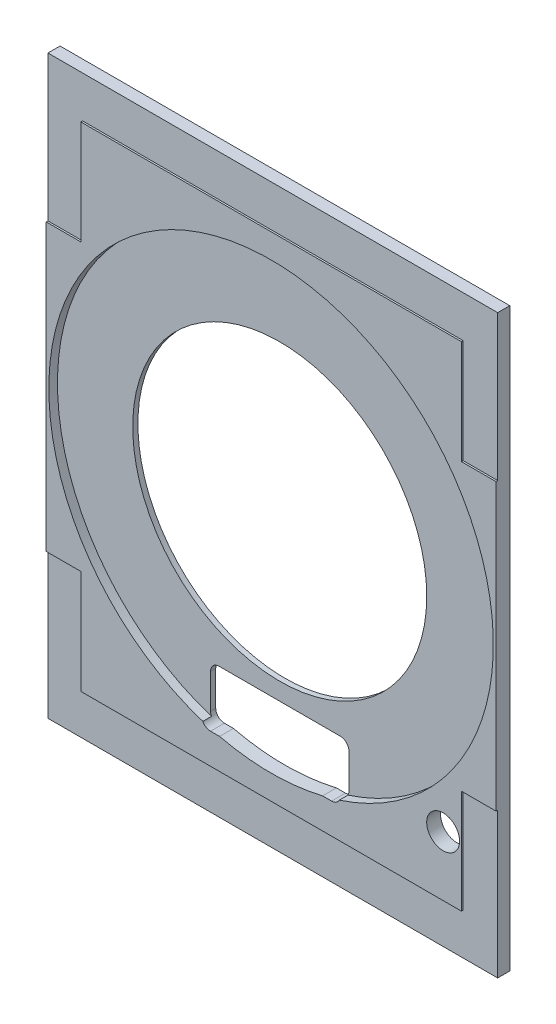
ISO-10303-21;
HEADER;
FILE_DESCRIPTION(('STEP AP214'),'2;1');
FILE_NAME('part.step','',(''),(''),'','','');
FILE_SCHEMA(('AUTOMOTIVE_DESIGN { 1 0 10303 214 1 1 1 1 }'));
ENDSEC;
DATA;
#1=APPLICATION_CONTEXT('core data for automotive mechanical design processes');
#2=APPLICATION_PROTOCOL_DEFINITION('international standard','automotive_design',2000,#1);
#3=PRODUCT_CONTEXT('',#1,'mechanical');
#4=PRODUCT('Part','Part','',(#3));
#5=PRODUCT_RELATED_PRODUCT_CATEGORY('part','',(#4));
#6=PRODUCT_DEFINITION_FORMATION('','',#4);
#7=PRODUCT_DEFINITION_CONTEXT('part definition',#1,'design');
#8=PRODUCT_DEFINITION('design','',#6,#7);
#9=PRODUCT_DEFINITION_SHAPE('','',#8);
#10=(LENGTH_UNIT() NAMED_UNIT(*) SI_UNIT(.MILLI.,.METRE.));
#11=(NAMED_UNIT(*) PLANE_ANGLE_UNIT() SI_UNIT($,.RADIAN.));
#12=(NAMED_UNIT(*) SI_UNIT($,.STERADIAN.) SOLID_ANGLE_UNIT());
#13=UNCERTAINTY_MEASURE_WITH_UNIT(LENGTH_MEASURE(1.E-05),#10,'distance_accuracy_value','');
#14=(GEOMETRIC_REPRESENTATION_CONTEXT(3) GLOBAL_UNCERTAINTY_ASSIGNED_CONTEXT((#13)) GLOBAL_UNIT_ASSIGNED_CONTEXT((#10,
#11,#12)) REPRESENTATION_CONTEXT('',''));
#15=CARTESIAN_POINT('',(0.,0.,0.));
#16=DIRECTION('',(0.,0.,1.));
#17=DIRECTION('',(1.,0.,0.));
#18=AXIS2_PLACEMENT_3D('',#15,#16,#17);
#19=CARTESIAN_POINT('',(-86.6793476114973,-420.602297752564,-868.98578652296));
#20=DIRECTION('',(1.,0.,0.));
#21=DIRECTION('',(0.,1.,0.));
#22=AXIS2_PLACEMENT_3D('',#19,#20,#21);
#23=PLANE('',#22);
#24=DIRECTION('',(0.,1.,0.));
#25=VECTOR('',#24,1.);
#26=CARTESIAN_POINT('',(-86.6793476114973,-420.602297752566,-899.48578652296));
#27=LINE('',#26,#25);
#28=CARTESIAN_POINT('',(-86.6793451287472,-503.102316223515,-899.48578652296));
#29=VERTEX_POINT('',#28);
#30=CARTESIAN_POINT('',(-86.6793476114973,-563.179524908949,-899.48578652296));
#31=VERTEX_POINT('',#30);
#32=EDGE_CURVE('E220',#29,#31,#27,.F.);
#33=ORIENTED_EDGE('',*,*,#32,.F.);
#34=DIRECTION('',(0.,0.,1.));
#35=VECTOR('',#34,1.);
#36=CARTESIAN_POINT('',(-86.6793426459971,-503.102316223515,-881.985844802857));
#37=LINE('',#36,#35);
#38=CARTESIAN_POINT('',(-86.6793451287472,-503.102316223515,-898.485786522958));
#39=VERTEX_POINT('',#38);
#40=EDGE_CURVE('E243',#39,#29,#37,.F.);
#41=ORIENTED_EDGE('',*,*,#40,.F.);
#42=DIRECTION('',(0.,1.,0.));
#43=VECTOR('',#42,1.);
#44=CARTESIAN_POINT('',(-86.6793426459971,-420.602282333374,-898.485786522958));
#45=LINE('',#44,#43);
#46=CARTESIAN_POINT('',(-86.6793463701223,-563.179524908949,-898.485786522958));
#47=VERTEX_POINT('',#46);
#48=EDGE_CURVE('E125',#39,#47,#45,.F.);
#49=ORIENTED_EDGE('',*,*,#48,.T.);
#50=DIRECTION('',(0.,0.,-1.));
#51=VECTOR('',#50,1.);
#52=CARTESIAN_POINT('',(-86.6793476114973,-563.179524908949,-866.48578652296));
#53=LINE('',#52,#51);
#54=EDGE_CURVE('E272',#31,#47,#53,.F.);
#55=ORIENTED_EDGE('',*,*,#54,.F.);
#56=EDGE_LOOP('',(#33,#41,#49,#55));
#57=FACE_BOUND('',#56,.T.);
#58=ADVANCED_FACE('F17',(#57),#23,.T.);
#59=CARTESIAN_POINT('',(-196.679347611489,-563.179524908949,-866.48578652296));
#60=DIRECTION('',(0.,-1.,0.));
#61=DIRECTION('',(0.,0.,-1.));
#62=AXIS2_PLACEMENT_3D('',#59,#60,#61);
#63=PLANE('',#62);
#64=DIRECTION('',(0.,0.,1.));
#65=VECTOR('',#64,1.);
#66=CARTESIAN_POINT('',(-306.686091028778,-563.179524908949,-868.98578652296));
#67=LINE('',#66,#65);
#68=CARTESIAN_POINT('',(-306.686091028778,-563.179524908949,-899.48578652296));
#69=VERTEX_POINT('',#68);
#70=CARTESIAN_POINT('',(-306.686091028778,-563.179524908949,-898.485786522958));
#71=VERTEX_POINT('',#70);
#72=EDGE_CURVE('E269',#69,#71,#67,.T.);
#73=ORIENTED_EDGE('',*,*,#72,.F.);
#74=DIRECTION('',(1.,0.,0.));
#75=VECTOR('',#74,1.);
#76=CARTESIAN_POINT('',(-316.686091028776,-563.179524908949,-899.48578652296));
#77=LINE('',#76,#75);
#78=EDGE_CURVE('E217',#31,#69,#77,.F.);
#79=ORIENTED_EDGE('',*,*,#78,.F.);
#80=ORIENTED_EDGE('',*,*,#54,.T.);
#81=DIRECTION('',(-1.,0.,0.));
#82=VECTOR('',#81,1.);
#83=CARTESIAN_POINT('',(-196.682719320139,-563.179524908949,-898.485786522958));
#84=LINE('',#83,#82);
#85=EDGE_CURVE('E199',#47,#71,#84,.T.);
#86=ORIENTED_EDGE('',*,*,#85,.T.);
#87=EDGE_LOOP('',(#73,#79,#80,#86));
#88=FACE_BOUND('',#87,.T.);
#89=ADVANCED_FACE('F487',(#88),#63,.T.);
#90=CARTESIAN_POINT('',(-306.686091028778,-420.602297752566,-868.98578652296));
#91=DIRECTION('',(-1.,0.,0.));
#92=DIRECTION('',(0.,0.,1.));
#93=AXIS2_PLACEMENT_3D('',#90,#91,#92);
#94=PLANE('',#93);
#95=DIRECTION('',(0.,1.,0.));
#96=VECTOR('',#95,1.);
#97=CARTESIAN_POINT('',(-306.686091028778,-420.602297752566,-899.48578652296));
#98=LINE('',#97,#96);
#99=CARTESIAN_POINT('',(-306.686091028778,-503.102285385131,-899.48578652296));
#100=VERTEX_POINT('',#99);
#101=EDGE_CURVE('E214',#69,#100,#98,.T.);
#102=ORIENTED_EDGE('',*,*,#101,.F.);
#103=ORIENTED_EDGE('',*,*,#72,.T.);
#104=DIRECTION('',(0.,1.,0.));
#105=VECTOR('',#104,1.);
#106=CARTESIAN_POINT('',(-306.686091028778,-420.602282333374,-898.485786522958));
#107=LINE('',#106,#105);
#108=CARTESIAN_POINT('',(-306.686091028778,-503.102285385131,-898.485786522958));
#109=VERTEX_POINT('',#108);
#110=EDGE_CURVE('E196',#71,#109,#107,.T.);
#111=ORIENTED_EDGE('',*,*,#110,.T.);
#112=DIRECTION('',(0.,0.,-1.));
#113=VECTOR('',#112,1.);
#114=CARTESIAN_POINT('',(-306.686091028778,-503.102285385131,-881.985844802857));
#115=LINE('',#114,#113);
#116=EDGE_CURVE('E263',#100,#109,#115,.F.);
#117=ORIENTED_EDGE('',*,*,#116,.F.);
#118=EDGE_LOOP('',(#102,#103,#111,#117));
#119=FACE_BOUND('',#118,.T.);
#120=ADVANCED_FACE('F484',(#119),#94,.T.);
#121=CARTESIAN_POINT('',(-306.686100959777,-503.102285385131,-881.985844802857));
#122=DIRECTION('',(0.,-1.,0.));
#123=DIRECTION('',(0.,0.,-1.));
#124=AXIS2_PLACEMENT_3D('',#121,#122,#123);
#125=PLANE('',#124);
#126=DIRECTION('',(1.,0.,0.));
#127=VECTOR('',#126,1.);
#128=CARTESIAN_POINT('',(-316.686091028776,-503.102285385131,-899.48578652296));
#129=LINE('',#128,#127);
#130=CARTESIAN_POINT('',(-326.686091028777,-503.102285385131,-899.48578652296));
#131=VERTEX_POINT('',#130);
#132=EDGE_CURVE('E126',#100,#131,#129,.F.);
#133=ORIENTED_EDGE('',*,*,#132,.F.);
#134=ORIENTED_EDGE('',*,*,#116,.T.);
#135=DIRECTION('',(-1.,0.,0.));
#136=VECTOR('',#135,1.);
#137=CARTESIAN_POINT('',(-196.682719320139,-503.102285385131,-898.485786522958));
#138=LINE('',#137,#136);
#139=CARTESIAN_POINT('',(-326.686091028777,-503.102285385131,-898.485786522958));
#140=VERTEX_POINT('',#139);
#141=EDGE_CURVE('E193',#109,#140,#138,.T.);
#142=ORIENTED_EDGE('',*,*,#141,.T.);
#143=DIRECTION('',(0.,0.,-1.));
#144=VECTOR('',#143,1.);
#145=CARTESIAN_POINT('',(-326.686091028777,-503.102285385131,-881.985844802857));
#146=LINE('',#145,#144);
#147=EDGE_CURVE('E266',#140,#131,#146,.T.);
#148=ORIENTED_EDGE('',*,*,#147,.T.);
#149=EDGE_LOOP('',(#133,#134,#142,#148));
#150=FACE_BOUND('',#149,.T.);
#151=ADVANCED_FACE('F481',(#150),#125,.T.);
#152=CARTESIAN_POINT('',(-306.686100959777,-338.102279281615,-881.985844802857));
#153=DIRECTION('',(0.,1.,0.));
#154=DIRECTION('',(0.,0.,1.));
#155=AXIS2_PLACEMENT_3D('',#152,#153,#154);
#156=PLANE('',#155);
#157=DIRECTION('',(1.,0.,0.));
#158=VECTOR('',#157,1.);
#159=CARTESIAN_POINT('',(-316.686091028779,-338.102279281615,-899.48578652296));
#160=LINE('',#159,#158);
#161=CARTESIAN_POINT('',(-326.686091028777,-338.102279281615,-899.48578652296));
#162=VERTEX_POINT('',#161);
#163=CARTESIAN_POINT('',(-306.686091028778,-338.102279281615,-899.48578652296));
#164=VERTEX_POINT('',#163);
#165=EDGE_CURVE('E226',#162,#164,#160,.T.);
#166=ORIENTED_EDGE('',*,*,#165,.F.);
#167=DIRECTION('',(0.,0.,1.));
#168=VECTOR('',#167,1.);
#169=CARTESIAN_POINT('',(-326.686091028777,-338.102279281615,-881.985844802857));
#170=LINE('',#169,#168);
#171=CARTESIAN_POINT('',(-326.686091028777,-338.102279281615,-898.485786522958));
#172=VERTEX_POINT('',#171);
#173=EDGE_CURVE('E260',#162,#172,#170,.T.);
#174=ORIENTED_EDGE('',*,*,#173,.T.);
#175=DIRECTION('',(-1.,0.,0.));
#176=VECTOR('',#175,1.);
#177=CARTESIAN_POINT('',(-196.682719320139,-338.102279281615,-898.485786522958));
#178=LINE('',#177,#176);
#179=CARTESIAN_POINT('',(-306.686091028778,-338.102279281615,-898.485786522958));
#180=VERTEX_POINT('',#179);
#181=EDGE_CURVE('E190',#172,#180,#178,.F.);
#182=ORIENTED_EDGE('',*,*,#181,.T.);
#183=DIRECTION('',(0.,0.,1.));
#184=VECTOR('',#183,1.);
#185=CARTESIAN_POINT('',(-306.686091028778,-338.102279281615,-868.98578652296));
#186=LINE('',#185,#184);
#187=EDGE_CURVE('E257',#164,#180,#186,.T.);
#188=ORIENTED_EDGE('',*,*,#187,.F.);
#189=EDGE_LOOP('',(#166,#174,#182,#188));
#190=FACE_BOUND('',#189,.T.);
#191=ADVANCED_FACE('F459',(#190),#156,.T.);
#192=CARTESIAN_POINT('',(-306.686091028778,-420.602297752566,-868.98578652296));
#193=DIRECTION('',(-1.,0.,0.));
#194=DIRECTION('',(0.,0.,1.));
#195=AXIS2_PLACEMENT_3D('',#192,#193,#194);
#196=PLANE('',#195);
#197=DIRECTION('',(0.,1.,0.));
#198=VECTOR('',#197,1.);
#199=CARTESIAN_POINT('',(-306.686091028778,-420.602297752566,-899.48578652296));
#200=LINE('',#199,#198);
#201=CARTESIAN_POINT('',(-306.686091028778,-278.025070596186,-899.48578652296));
#202=VERTEX_POINT('',#201);
#203=EDGE_CURVE('E238',#164,#202,#200,.T.);
#204=ORIENTED_EDGE('',*,*,#203,.F.);
#205=ORIENTED_EDGE('',*,*,#187,.T.);
#206=DIRECTION('',(0.,1.,0.));
#207=VECTOR('',#206,1.);
#208=CARTESIAN_POINT('',(-306.686091028778,-420.602282333374,-898.485786522958));
#209=LINE('',#208,#207);
#210=CARTESIAN_POINT('',(-306.686091028778,-278.025070596186,-898.485786522958));
#211=VERTEX_POINT('',#210);
#212=EDGE_CURVE('E187',#180,#211,#209,.T.);
#213=ORIENTED_EDGE('',*,*,#212,.T.);
#214=DIRECTION('',(0.,0.,1.));
#215=VECTOR('',#214,1.);
#216=CARTESIAN_POINT('',(-306.686091028778,-278.025070596186,-866.48578652296));
#217=LINE('',#216,#215);
#218=EDGE_CURVE('E254',#202,#211,#217,.T.);
#219=ORIENTED_EDGE('',*,*,#218,.F.);
#220=EDGE_LOOP('',(#204,#205,#213,#219));
#221=FACE_BOUND('',#220,.T.);
#222=ADVANCED_FACE('F449',(#221),#196,.T.);
#223=CARTESIAN_POINT('',(-196.686091028777,-278.025070596186,-866.48578652296));
#224=DIRECTION('',(0.,1.,0.));
#225=DIRECTION('',(-1.,0.,0.));
#226=AXIS2_PLACEMENT_3D('',#223,#224,#225);
#227=PLANE('',#226);
#228=ORIENTED_EDGE('',*,*,#218,.T.);
#229=DIRECTION('',(-1.,0.,0.));
#230=VECTOR('',#229,1.);
#231=CARTESIAN_POINT('',(-196.682719320139,-278.025070596186,-898.485786522958));
#232=LINE('',#231,#230);
#233=CARTESIAN_POINT('',(-86.6793476114973,-278.025070596186,-898.485786522958));
#234=VERTEX_POINT('',#233);
#235=EDGE_CURVE('E184',#211,#234,#232,.F.);
#236=ORIENTED_EDGE('',*,*,#235,.T.);
#237=DIRECTION('',(0.,0.,1.));
#238=VECTOR('',#237,1.);
#239=CARTESIAN_POINT('',(-86.6793476114973,-278.025070596186,-868.98578652296));
#240=LINE('',#239,#238);
#241=CARTESIAN_POINT('',(-86.6793476114973,-278.025070596186,-899.48578652296));
#242=VERTEX_POINT('',#241);
#243=EDGE_CURVE('E251',#242,#234,#240,.T.);
#244=ORIENTED_EDGE('',*,*,#243,.F.);
#245=DIRECTION('',(1.,0.,0.));
#246=VECTOR('',#245,1.);
#247=CARTESIAN_POINT('',(-316.686091028779,-278.025070596186,-899.48578652296));
#248=LINE('',#247,#246);
#249=EDGE_CURVE('E235',#202,#242,#248,.T.);
#250=ORIENTED_EDGE('',*,*,#249,.F.);
#251=EDGE_LOOP('',(#228,#236,#244,#250));
#252=FACE_BOUND('',#251,.T.);
#253=ADVANCED_FACE('F453',(#252),#227,.T.);
#254=CARTESIAN_POINT('',(-86.6793476114973,-420.602297752564,-868.98578652296));
#255=DIRECTION('',(1.,0.,0.));
#256=DIRECTION('',(0.,1.,0.));
#257=AXIS2_PLACEMENT_3D('',#254,#255,#256);
#258=PLANE('',#257);
#259=DIRECTION('',(0.,1.,0.));
#260=VECTOR('',#259,1.);
#261=CARTESIAN_POINT('',(-86.6793476114973,-420.602297752566,-899.48578652296));
#262=LINE('',#261,#260);
#263=CARTESIAN_POINT('',(-86.6793476114973,-338.102310119999,-899.48578652296));
#264=VERTEX_POINT('',#263);
#265=EDGE_CURVE('E232',#242,#264,#262,.F.);
#266=ORIENTED_EDGE('',*,*,#265,.F.);
#267=ORIENTED_EDGE('',*,*,#243,.T.);
#268=DIRECTION('',(0.,1.,0.));
#269=VECTOR('',#268,1.);
#270=CARTESIAN_POINT('',(-86.6793476114973,-420.602282333374,-898.485786522958));
#271=LINE('',#270,#269);
#272=CARTESIAN_POINT('',(-86.6793476114973,-338.102310119999,-898.485786522958));
#273=VERTEX_POINT('',#272);
#274=EDGE_CURVE('E177',#234,#273,#271,.F.);
#275=ORIENTED_EDGE('',*,*,#274,.T.);
#276=DIRECTION('',(0.,0.,1.));
#277=VECTOR('',#276,1.);
#278=CARTESIAN_POINT('',(-86.6793476114973,-338.102310119999,-881.985844802857));
#279=LINE('',#278,#277);
#280=EDGE_CURVE('E245',#264,#273,#279,.T.);
#281=ORIENTED_EDGE('',*,*,#280,.F.);
#282=EDGE_LOOP('',(#266,#267,#275,#281));
#283=FACE_BOUND('',#282,.T.);
#284=ADVANCED_FACE('F467',(#283),#258,.T.);
#285=CARTESIAN_POINT('',(-86.6793376804968,-338.102310119999,-881.985844802857));
#286=DIRECTION('',(0.,1.,0.));
#287=DIRECTION('',(-1.,0.,0.));
#288=AXIS2_PLACEMENT_3D('',#285,#286,#287);
#289=PLANE('',#288);
#290=DIRECTION('',(1.,0.,0.));
#291=VECTOR('',#290,1.);
#292=CARTESIAN_POINT('',(-316.686091028779,-338.102310119999,-899.48578652296));
#293=LINE('',#292,#291);
#294=CARTESIAN_POINT('',(-66.6793476115006,-338.102310119999,-899.48578652296));
#295=VERTEX_POINT('',#294);
#296=EDGE_CURVE('E229',#264,#295,#293,.T.);
#297=ORIENTED_EDGE('',*,*,#296,.F.);
#298=ORIENTED_EDGE('',*,*,#280,.T.);
#299=DIRECTION('',(-1.,0.,0.));
#300=VECTOR('',#299,1.);
#301=CARTESIAN_POINT('',(-196.682719320139,-338.102310119999,-898.485786522958));
#302=LINE('',#301,#300);
#303=CARTESIAN_POINT('',(-66.6793476115006,-338.102310119999,-898.485786522958));
#304=VERTEX_POINT('',#303);
#305=EDGE_CURVE('E168',#273,#304,#302,.F.);
#306=ORIENTED_EDGE('',*,*,#305,.T.);
#307=DIRECTION('',(0.,0.,1.));
#308=VECTOR('',#307,1.);
#309=CARTESIAN_POINT('',(-66.6793476115006,-338.102310119999,-881.985844802857));
#310=LINE('',#309,#308);
#311=EDGE_CURVE('E248',#304,#295,#310,.F.);
#312=ORIENTED_EDGE('',*,*,#311,.T.);
#313=EDGE_LOOP('',(#297,#298,#306,#312));
#314=FACE_BOUND('',#313,.T.);
#315=ADVANCED_FACE('F492',(#314),#289,.T.);
#316=CARTESIAN_POINT('',(-86.6793376804968,-503.102316223515,-881.985844802857));
#317=DIRECTION('',(0.,-1.,0.));
#318=DIRECTION('',(1.,0.,0.));
#319=AXIS2_PLACEMENT_3D('',#316,#317,#318);
#320=PLANE('',#319);
#321=DIRECTION('',(1.,0.,0.));
#322=VECTOR('',#321,1.);
#323=CARTESIAN_POINT('',(-316.686091028776,-503.102316223515,-899.48578652296));
#324=LINE('',#323,#322);
#325=CARTESIAN_POINT('',(-66.6793476115006,-503.102316223515,-899.48578652296));
#326=VERTEX_POINT('',#325);
#327=EDGE_CURVE('E223',#326,#29,#324,.F.);
#328=ORIENTED_EDGE('',*,*,#327,.F.);
#329=DIRECTION('',(0.,0.,1.));
#330=VECTOR('',#329,1.);
#331=CARTESIAN_POINT('',(-66.6793476115006,-503.102316223515,-881.985844802857));
#332=LINE('',#331,#330);
#333=CARTESIAN_POINT('',(-66.6793476115006,-503.102316223515,-898.485786522958));
#334=VERTEX_POINT('',#333);
#335=EDGE_CURVE('E241',#326,#334,#332,.T.);
#336=ORIENTED_EDGE('',*,*,#335,.T.);
#337=DIRECTION('',(-1.,0.,0.));
#338=VECTOR('',#337,1.);
#339=CARTESIAN_POINT('',(-196.682719320139,-503.102316223515,-898.485786522958));
#340=LINE('',#339,#338);
#341=EDGE_CURVE('E163',#334,#39,#340,.T.);
#342=ORIENTED_EDGE('',*,*,#341,.T.);
#343=ORIENTED_EDGE('',*,*,#40,.T.);
#344=EDGE_LOOP('',(#328,#336,#342,#343));
#345=FACE_BOUND('',#344,.T.);
#346=ADVANCED_FACE('F491',(#345),#320,.T.);
#347=CARTESIAN_POINT('',(-316.686091028779,-420.602297752566,-899.48578652296));
#348=DIRECTION('',(0.,0.,1.));
#349=DIRECTION('',(1.,0.,0.));
#350=AXIS2_PLACEMENT_3D('',#347,#348,#349);
#351=PLANE('',#350);
#352=DIRECTION('',(0.,1.,0.));
#353=VECTOR('',#352,1.);
#354=CARTESIAN_POINT('',(-326.686091028777,-420.602282333374,-899.48578652296));
#355=LINE('',#354,#353);
#356=CARTESIAN_POINT('',(-326.686091028777,-254.025070596186,-899.48578652296));
#357=VERTEX_POINT('',#356);
#358=EDGE_CURVE('E353',#357,#162,#355,.F.);
#359=ORIENTED_EDGE('',*,*,#358,.T.);
#360=ORIENTED_EDGE('',*,*,#165,.T.);
#361=ORIENTED_EDGE('',*,*,#203,.T.);
#362=ORIENTED_EDGE('',*,*,#249,.T.);
#363=ORIENTED_EDGE('',*,*,#265,.T.);
#364=ORIENTED_EDGE('',*,*,#296,.T.);
#365=DIRECTION('',(0.,1.,0.));
#366=VECTOR('',#365,1.);
#367=CARTESIAN_POINT('',(-66.6793476115006,-420.602282333374,-899.48578652296));
#368=LINE('',#367,#366);
#369=CARTESIAN_POINT('',(-66.6793476115006,-254.025070596186,-899.48578652296));
#370=VERTEX_POINT('',#369);
#371=EDGE_CURVE('E341',#295,#370,#368,.T.);
#372=ORIENTED_EDGE('',*,*,#371,.T.);
#373=DIRECTION('',(1.,0.,0.));
#374=VECTOR('',#373,1.);
#375=CARTESIAN_POINT('',(-196.682719320139,-254.025070596186,-899.48578652296));
#376=LINE('',#375,#374);
#377=EDGE_CURVE('E347',#370,#357,#376,.F.);
#378=ORIENTED_EDGE('',*,*,#377,.T.);
#379=EDGE_LOOP('',(#359,#360,#361,#362,#363,#364,#372,#378));
#380=FACE_BOUND('',#379,.T.);
#381=ADVANCED_FACE('F456',(#380),#351,.T.);
#382=CARTESIAN_POINT('',(-316.686091028776,-420.602297752566,-899.48578652296));
#383=DIRECTION('',(0.,0.,1.));
#384=DIRECTION('',(1.,0.,0.));
#385=AXIS2_PLACEMENT_3D('',#382,#383,#384);
#386=PLANE('',#385);
#387=ORIENTED_EDGE('',*,*,#132,.T.);
#388=DIRECTION('',(0.,1.,0.));
#389=VECTOR('',#388,1.);
#390=CARTESIAN_POINT('',(-326.686091028777,-420.602282333374,-899.48578652296));
#391=LINE('',#390,#389);
#392=CARTESIAN_POINT('',(-326.686091028777,-587.179524908948,-899.48578652296));
#393=VERTEX_POINT('',#392);
#394=EDGE_CURVE('E165',#131,#393,#391,.F.);
#395=ORIENTED_EDGE('',*,*,#394,.T.);
#396=DIRECTION('',(1.,0.,0.));
#397=VECTOR('',#396,1.);
#398=CARTESIAN_POINT('',(-196.682719320139,-587.179524908949,-899.48578652296));
#399=LINE('',#398,#397);
#400=CARTESIAN_POINT('',(-66.6793476115006,-587.179524908948,-899.48578652296));
#401=VERTEX_POINT('',#400);
#402=EDGE_CURVE('E161',#393,#401,#399,.T.);
#403=ORIENTED_EDGE('',*,*,#402,.T.);
#404=DIRECTION('',(0.,1.,0.));
#405=VECTOR('',#404,1.);
#406=CARTESIAN_POINT('',(-66.6793476115006,-420.602282333374,-899.48578652296));
#407=LINE('',#406,#405);
#408=EDGE_CURVE('E335',#401,#326,#407,.T.);
#409=ORIENTED_EDGE('',*,*,#408,.T.);
#410=ORIENTED_EDGE('',*,*,#327,.T.);
#411=ORIENTED_EDGE('',*,*,#32,.T.);
#412=ORIENTED_EDGE('',*,*,#78,.T.);
#413=ORIENTED_EDGE('',*,*,#101,.T.);
#414=EDGE_LOOP('',(#387,#395,#403,#409,#410,#411,#412,#413));
#415=FACE_BOUND('',#414,.T.);
#416=ADVANCED_FACE('F359',(#415),#386,.T.);
#417=CARTESIAN_POINT('',(-196.682719320139,-420.602297752566,-900.985786522959));
#418=DIRECTION('',(0.,0.,-1.));
#419=DIRECTION('',(-1.,0.,0.));
#420=AXIS2_PLACEMENT_3D('',#417,#418,#419);
#421=CYLINDRICAL_SURFACE('',#420,128.5);
#422=DIRECTION('',(0.,0.,-1.));
#423=VECTOR('',#422,1.);
#424=CARTESIAN_POINT('',(-236.123644681175,-542.899736019543,-896.485783386231));
#425=LINE('',#424,#423);
#426=CARTESIAN_POINT('',(-236.123644681175,-542.899736019543,-898.485786522958));
#427=VERTEX_POINT('',#426);
#428=CARTESIAN_POINT('',(-236.123644681175,-542.899736019543,-903.485786522959));
#429=VERTEX_POINT('',#428);
#430=EDGE_CURVE('E108',#427,#429,#425,.T.);
#431=ORIENTED_EDGE('',*,*,#430,.T.);
#432=CARTESIAN_POINT('',(-196.682719320139,-420.602297752566,-903.485786522959));
#433=DIRECTION('',(0.,0.,-1.));
#434=DIRECTION('',(-1.,0.,0.));
#435=AXIS2_PLACEMENT_3D('',#432,#433,#434);
#436=CIRCLE('',#435,128.5);
#437=CARTESIAN_POINT('',(-157.241780466397,-542.899731668145,-903.485786522959));
#438=VERTEX_POINT('',#437);
#439=EDGE_CURVE('E20',#429,#438,#436,.T.);
#440=ORIENTED_EDGE('',*,*,#439,.T.);
#441=DIRECTION('',(0.,0.,-1.));
#442=VECTOR('',#441,1.);
#443=CARTESIAN_POINT('',(-157.241780466397,-542.899731668145,-896.485783386231));
#444=LINE('',#443,#442);
#445=CARTESIAN_POINT('',(-157.241780466397,-542.899731668145,-898.485786522958));
#446=VERTEX_POINT('',#445);
#447=EDGE_CURVE('E150',#438,#446,#444,.F.);
#448=ORIENTED_EDGE('',*,*,#447,.T.);
#449=CARTESIAN_POINT('',(-196.682719320139,-420.602297752566,-898.485786522958));
#450=DIRECTION('',(0.,0.,-1.));
#451=DIRECTION('',(-1.,0.,0.));
#452=AXIS2_PLACEMENT_3D('',#449,#450,#451);
#453=CIRCLE('',#452,128.5);
#454=EDGE_CURVE('E113',#446,#427,#453,.F.);
#455=ORIENTED_EDGE('',*,*,#454,.T.);
#456=EDGE_LOOP('',(#431,#440,#448,#455));
#457=FACE_BOUND('',#456,.T.);
#458=ADVANCED_FACE('F110',(#457),#421,.F.);
#459=CARTESIAN_POINT('',(-196.682719320139,-420.602297752566,-903.485786522959));
#460=DIRECTION('',(0.,0.,-1.));
#461=DIRECTION('',(-1.,0.,0.));
#462=AXIS2_PLACEMENT_3D('',#459,#460,#461);
#463=PLANE('',#462);
#464=CARTESIAN_POINT('',(-196.682719320139,-420.602297752566,-903.485786522959));
#465=DIRECTION('',(0.,0.,1.));
#466=DIRECTION('',(1.,0.,0.));
#467=AXIS2_PLACEMENT_3D('',#464,#465,#466);
#468=CIRCLE('',#467,85.0000000000001);
#469=CARTESIAN_POINT('',(-111.682719320139,-420.602297752566,-903.485786522959));
#470=VERTEX_POINT('',#469);
#471=EDGE_CURVE('E156',#470,#470,#468,.F.);
#472=ORIENTED_EDGE('',*,*,#471,.T.);
#473=EDGE_LOOP('',(#472));
#474=FACE_BOUND('',#473,.T.);
#475=CARTESIAN_POINT('',(-231.682718849182,-540.602307510375,-903.485786522959));
#476=DIRECTION('',(0.,0.,-1.));
#477=DIRECTION('',(-1.,0.,0.));
#478=AXIS2_PLACEMENT_3D('',#475,#476,#477);
#479=CIRCLE('',#478,4.99999999999999);
#480=CARTESIAN_POINT('',(-236.682718849182,-540.602307510375,-903.485786522959));
#481=VERTEX_POINT('',#480);
#482=EDGE_CURVE('E116',#429,#481,#479,.T.);
#483=ORIENTED_EDGE('',*,*,#482,.T.);
#484=DIRECTION('',(0.,1.,0.));
#485=VECTOR('',#484,1.);
#486=CARTESIAN_POINT('',(-236.682718849182,-530.602302551268,-903.485786522959));
#487=LINE('',#486,#485);
#488=CARTESIAN_POINT('',(-236.682718849182,-520.602297592165,-903.485786522959));
#489=VERTEX_POINT('',#488);
#490=EDGE_CURVE('E139',#481,#489,#487,.T.);
#491=ORIENTED_EDGE('',*,*,#490,.T.);
#492=CARTESIAN_POINT('',(-231.682718849182,-520.602297592164,-903.485786522959));
#493=DIRECTION('',(0.,0.,-1.));
#494=DIRECTION('',(-1.,0.,0.));
#495=AXIS2_PLACEMENT_3D('',#492,#493,#494);
#496=CIRCLE('',#495,4.99999999999999);
#497=CARTESIAN_POINT('',(-231.682718849181,-515.602297592164,-903.485786522959));
#498=VERTEX_POINT('',#497);
#499=EDGE_CURVE('E136',#489,#498,#496,.T.);
#500=ORIENTED_EDGE('',*,*,#499,.T.);
#501=DIRECTION('',(1.,0.,0.));
#502=VECTOR('',#501,1.);
#503=CARTESIAN_POINT('',(-196.682713699341,-515.602297592164,-903.485786522959));
#504=LINE('',#503,#502);
#505=CARTESIAN_POINT('',(-161.6827085495,-515.602297592164,-903.485786522959));
#506=VERTEX_POINT('',#505);
#507=EDGE_CURVE('E144',#498,#506,#504,.T.);
#508=ORIENTED_EDGE('',*,*,#507,.T.);
#509=CARTESIAN_POINT('',(-161.6827085495,-520.602297592164,-903.485786522959));
#510=DIRECTION('',(0.,0.,-1.));
#511=DIRECTION('',(-1.,0.,0.));
#512=AXIS2_PLACEMENT_3D('',#509,#510,#511);
#513=CIRCLE('',#512,4.99999999999999);
#514=CARTESIAN_POINT('',(-156.682708549499,-520.602297592165,-903.485786522959));
#515=VERTEX_POINT('',#514);
#516=EDGE_CURVE('E141',#506,#515,#513,.T.);
#517=ORIENTED_EDGE('',*,*,#516,.T.);
#518=DIRECTION('',(0.,1.,0.));
#519=VECTOR('',#518,1.);
#520=CARTESIAN_POINT('',(-156.682708549499,-530.602302551268,-903.485786522959));
#521=LINE('',#520,#519);
#522=CARTESIAN_POINT('',(-156.682708549499,-540.602307510375,-903.485786522959));
#523=VERTEX_POINT('',#522);
#524=EDGE_CURVE('E149',#515,#523,#521,.F.);
#525=ORIENTED_EDGE('',*,*,#524,.T.);
#526=CARTESIAN_POINT('',(-161.6827085495,-540.602307510375,-903.485786522959));
#527=DIRECTION('',(0.,0.,-1.));
#528=DIRECTION('',(-1.,0.,0.));
#529=AXIS2_PLACEMENT_3D('',#526,#527,#528);
#530=CIRCLE('',#529,4.99999999999999);
#531=EDGE_CURVE('E123',#523,#438,#530,.T.);
#532=ORIENTED_EDGE('',*,*,#531,.T.);
#533=ORIENTED_EDGE('',*,*,#439,.F.);
#534=EDGE_LOOP('',(#483,#491,#500,#508,#517,#525,#532,#533));
#535=FACE_BOUND('',#534,.T.);
#536=ADVANCED_FACE('F120',(#474,#535),#463,.F.);
#537=CARTESIAN_POINT('',(-196.682719320139,-420.602282333374,-898.485786522958));
#538=DIRECTION('',(0.,0.,-1.));
#539=DIRECTION('',(-1.,0.,0.));
#540=AXIS2_PLACEMENT_3D('',#537,#538,#539);
#541=PLANE('',#540);
#542=CARTESIAN_POINT('',(-231.682718849182,-540.602307510375,-898.485786522958));
#543=DIRECTION('',(0.,0.,-1.));
#544=DIRECTION('',(-1.,0.,0.));
#545=AXIS2_PLACEMENT_3D('',#542,#543,#544);
#546=CIRCLE('',#545,4.99999999999999);
#547=CARTESIAN_POINT('',(-231.682718849182,-545.602307510375,-898.485786522958));
#548=VERTEX_POINT('',#547);
#549=EDGE_CURVE('E131',#548,#427,#546,.T.);
#550=ORIENTED_EDGE('',*,*,#549,.T.);
#551=ORIENTED_EDGE('',*,*,#454,.F.);
#552=CARTESIAN_POINT('',(-161.6827085495,-540.602307510375,-898.485786522958));
#553=DIRECTION('',(0.,0.,-1.));
#554=DIRECTION('',(-1.,0.,0.));
#555=AXIS2_PLACEMENT_3D('',#552,#553,#554);
#556=CIRCLE('',#555,4.99999999999999);
#557=CARTESIAN_POINT('',(-161.6827085495,-545.602307510375,-898.485786522958));
#558=VERTEX_POINT('',#557);
#559=EDGE_CURVE('E146',#446,#558,#556,.T.);
#560=ORIENTED_EDGE('',*,*,#559,.T.);
#561=DIRECTION('',(1.,0.,0.));
#562=VECTOR('',#561,1.);
#563=CARTESIAN_POINT('',(-196.682713699341,-545.602307510375,-898.485786522958));
#564=LINE('',#563,#562);
#565=CARTESIAN_POINT('',(-166.896018251581,-545.602307510375,-898.485786522958));
#566=VERTEX_POINT('',#565);
#567=EDGE_CURVE('E155',#558,#566,#564,.F.);
#568=ORIENTED_EDGE('',*,*,#567,.T.);
#569=CARTESIAN_POINT('',(-196.682719320139,-420.602297752566,-898.485786522958));
#570=DIRECTION('',(0.,0.,-1.));
#571=DIRECTION('',(-1.,0.,0.));
#572=AXIS2_PLACEMENT_3D('',#569,#570,#571);
#573=CIRCLE('',#572,128.5);
#574=CARTESIAN_POINT('',(-226.469420388696,-545.602307510375,-898.485786522958));
#575=VERTEX_POINT('',#574);
#576=EDGE_CURVE('E153',#566,#575,#573,.T.);
#577=ORIENTED_EDGE('',*,*,#576,.T.);
#578=DIRECTION('',(1.,0.,0.));
#579=VECTOR('',#578,1.);
#580=CARTESIAN_POINT('',(-196.682713699341,-545.602307510375,-898.485786522958));
#581=LINE('',#580,#579);
#582=EDGE_CURVE('E180',#575,#548,#581,.F.);
#583=ORIENTED_EDGE('',*,*,#582,.T.);
#584=EDGE_LOOP('',(#550,#551,#560,#568,#577,#583));
#585=FACE_BOUND('',#584,.T.);
#586=CARTESIAN_POINT('',(-97.2215239892063,-528.739677168912,-898.485786522958));
#587=DIRECTION('',(0.,0.,-1.));
#588=DIRECTION('',(-1.,0.,0.));
#589=AXIS2_PLACEMENT_3D('',#586,#587,#588);
#590=CIRCLE('',#589,9.5);
#591=CARTESIAN_POINT('',(-106.721523989206,-528.739677168912,-898.485786522958));
#592=VERTEX_POINT('',#591);
#593=EDGE_CURVE('E159',#592,#592,#590,.T.);
#594=ORIENTED_EDGE('',*,*,#593,.T.);
#595=EDGE_LOOP('',(#594));
#596=FACE_BOUND('',#595,.T.);
#597=DIRECTION('',(0.,1.,0.));
#598=VECTOR('',#597,1.);
#599=CARTESIAN_POINT('',(-66.6793476115006,-420.602282333374,-898.485786522958));
#600=LINE('',#599,#598);
#601=EDGE_CURVE('E344',#334,#304,#600,.T.);
#602=ORIENTED_EDGE('',*,*,#601,.T.);
#603=ORIENTED_EDGE('',*,*,#305,.F.);
#604=ORIENTED_EDGE('',*,*,#274,.F.);
#605=ORIENTED_EDGE('',*,*,#235,.F.);
#606=ORIENTED_EDGE('',*,*,#212,.F.);
#607=ORIENTED_EDGE('',*,*,#181,.F.);
#608=DIRECTION('',(0.,1.,0.));
#609=VECTOR('',#608,1.);
#610=CARTESIAN_POINT('',(-326.686091028777,-420.602282333374,-898.485786522958));
#611=LINE('',#610,#609);
#612=EDGE_CURVE('E162',#172,#140,#611,.F.);
#613=ORIENTED_EDGE('',*,*,#612,.T.);
#614=ORIENTED_EDGE('',*,*,#141,.F.);
#615=ORIENTED_EDGE('',*,*,#110,.F.);
#616=ORIENTED_EDGE('',*,*,#85,.F.);
#617=ORIENTED_EDGE('',*,*,#48,.F.);
#618=ORIENTED_EDGE('',*,*,#341,.F.);
#619=EDGE_LOOP('',(#602,#603,#604,#605,#606,#607,#613,#614,#615,#616,#617,#618));
#620=FACE_BOUND('',#619,.T.);
#621=ADVANCED_FACE('F462',(#585,#596,#620),#541,.F.);
#622=CARTESIAN_POINT('',(-326.686091028777,-420.602282333374,-902.48578652296));
#623=DIRECTION('',(1.,0.,0.));
#624=DIRECTION('',(0.,0.,-1.));
#625=AXIS2_PLACEMENT_3D('',#622,#623,#624);
#626=PLANE('',#625);
#627=ORIENTED_EDGE('',*,*,#358,.F.);
#628=DIRECTION('',(0.,0.,-1.));
#629=VECTOR('',#628,1.);
#630=CARTESIAN_POINT('',(-326.686091028777,-254.025070596186,-902.48578652296));
#631=LINE('',#630,#629);
#632=CARTESIAN_POINT('',(-326.686091028777,-254.025070596186,-906.485786522959));
#633=VERTEX_POINT('',#632);
#634=EDGE_CURVE('E350',#357,#633,#631,.T.);
#635=ORIENTED_EDGE('',*,*,#634,.T.);
#636=DIRECTION('',(0.,1.,0.));
#637=VECTOR('',#636,1.);
#638=CARTESIAN_POINT('',(-326.686091028777,-420.602282333374,-906.485786522959));
#639=LINE('',#638,#637);
#640=CARTESIAN_POINT('',(-326.686091028777,-587.179524908948,-906.485786522959));
#641=VERTEX_POINT('',#640);
#642=EDGE_CURVE('E314',#641,#633,#639,.T.);
#643=ORIENTED_EDGE('',*,*,#642,.F.);
#644=DIRECTION('',(0.,0.,1.));
#645=VECTOR('',#644,1.);
#646=CARTESIAN_POINT('',(-326.686091028777,-587.179524908949,-902.48578652296));
#647=LINE('',#646,#645);
#648=EDGE_CURVE('E329',#641,#393,#647,.T.);
#649=ORIENTED_EDGE('',*,*,#648,.T.);
#650=ORIENTED_EDGE('',*,*,#394,.F.);
#651=ORIENTED_EDGE('',*,*,#147,.F.);
#652=ORIENTED_EDGE('',*,*,#612,.F.);
#653=ORIENTED_EDGE('',*,*,#173,.F.);
#654=EDGE_LOOP('',(#627,#635,#643,#649,#650,#651,#652,#653));
#655=FACE_BOUND('',#654,.T.);
#656=ADVANCED_FACE('F371',(#655),#626,.F.);
#657=CARTESIAN_POINT('',(-196.682719320139,-254.025070596186,-902.48578652296));
#658=DIRECTION('',(0.,-1.,0.));
#659=DIRECTION('',(0.,0.,-1.));
#660=AXIS2_PLACEMENT_3D('',#657,#658,#659);
#661=PLANE('',#660);
#662=DIRECTION('',(0.,0.,1.));
#663=VECTOR('',#662,1.);
#664=CARTESIAN_POINT('',(-66.6793476115006,-254.025070596186,-902.48578652296));
#665=LINE('',#664,#663);
#666=CARTESIAN_POINT('',(-66.6793476115006,-254.025070596186,-906.485786522959));
#667=VERTEX_POINT('',#666);
#668=EDGE_CURVE('E338',#370,#667,#665,.F.);
#669=ORIENTED_EDGE('',*,*,#668,.T.);
#670=DIRECTION('',(-1.,0.,0.));
#671=VECTOR('',#670,1.);
#672=CARTESIAN_POINT('',(-196.682719320139,-254.025070596186,-906.485786522959));
#673=LINE('',#672,#671);
#674=EDGE_CURVE('E307',#633,#667,#673,.F.);
#675=ORIENTED_EDGE('',*,*,#674,.F.);
#676=ORIENTED_EDGE('',*,*,#634,.F.);
#677=ORIENTED_EDGE('',*,*,#377,.F.);
#678=EDGE_LOOP('',(#669,#675,#676,#677));
#679=FACE_BOUND('',#678,.T.);
#680=ADVANCED_FACE('F475',(#679),#661,.F.);
#681=CARTESIAN_POINT('',(-66.6793476115006,-420.602282333374,-902.48578652296));
#682=DIRECTION('',(-1.,0.,0.));
#683=DIRECTION('',(0.,0.,1.));
#684=AXIS2_PLACEMENT_3D('',#681,#682,#683);
#685=PLANE('',#684);
#686=ORIENTED_EDGE('',*,*,#408,.F.);
#687=DIRECTION('',(0.,0.,1.));
#688=VECTOR('',#687,1.);
#689=CARTESIAN_POINT('',(-66.6793476115006,-587.179524908949,-902.48578652296));
#690=LINE('',#689,#688);
#691=CARTESIAN_POINT('',(-66.6793476115006,-587.179524908949,-906.485786522959));
#692=VERTEX_POINT('',#691);
#693=EDGE_CURVE('E332',#401,#692,#690,.F.);
#694=ORIENTED_EDGE('',*,*,#693,.T.);
#695=DIRECTION('',(0.,1.,0.));
#696=VECTOR('',#695,1.);
#697=CARTESIAN_POINT('',(-66.6793476115006,-420.602282333374,-906.485786522959));
#698=LINE('',#697,#696);
#699=EDGE_CURVE('E301',#667,#692,#698,.F.);
#700=ORIENTED_EDGE('',*,*,#699,.F.);
#701=ORIENTED_EDGE('',*,*,#668,.F.);
#702=ORIENTED_EDGE('',*,*,#371,.F.);
#703=ORIENTED_EDGE('',*,*,#311,.F.);
#704=ORIENTED_EDGE('',*,*,#601,.F.);
#705=ORIENTED_EDGE('',*,*,#335,.F.);
#706=EDGE_LOOP('',(#686,#694,#700,#701,#702,#703,#704,#705));
#707=FACE_BOUND('',#706,.T.);
#708=ADVANCED_FACE('F379',(#707),#685,.F.);
#709=CARTESIAN_POINT('',(-196.682719320139,-587.179524908949,-902.48578652296));
#710=DIRECTION('',(0.,1.,0.));
#711=DIRECTION('',(0.,0.,1.));
#712=AXIS2_PLACEMENT_3D('',#709,#710,#711);
#713=PLANE('',#712);
#714=ORIENTED_EDGE('',*,*,#648,.F.);
#715=DIRECTION('',(-1.,0.,0.));
#716=VECTOR('',#715,1.);
#717=CARTESIAN_POINT('',(-196.682719320139,-587.179524908949,-906.485786522959));
#718=LINE('',#717,#716);
#719=EDGE_CURVE('E297',#692,#641,#718,.T.);
#720=ORIENTED_EDGE('',*,*,#719,.F.);
#721=ORIENTED_EDGE('',*,*,#693,.F.);
#722=ORIENTED_EDGE('',*,*,#402,.F.);
#723=EDGE_LOOP('',(#714,#720,#721,#722));
#724=FACE_BOUND('',#723,.T.);
#725=ADVANCED_FACE('F373',(#724),#713,.F.);
#726=CARTESIAN_POINT('',(-97.2215239892063,-528.739677168912,-898.485786522958));
#727=DIRECTION('',(0.,0.,-1.));
#728=DIRECTION('',(-1.,0.,0.));
#729=AXIS2_PLACEMENT_3D('',#726,#727,#728);
#730=CYLINDRICAL_SURFACE('',#729,9.5);
#731=CARTESIAN_POINT('',(-97.2215239892063,-528.739677168912,-906.485786522959));
#732=DIRECTION('',(0.,0.,-1.));
#733=DIRECTION('',(-1.,0.,0.));
#734=AXIS2_PLACEMENT_3D('',#731,#732,#733);
#735=CIRCLE('',#734,9.5);
#736=CARTESIAN_POINT('',(-106.721523989206,-528.739677168912,-906.485786522959));
#737=VERTEX_POINT('',#736);
#738=EDGE_CURVE('E295',#737,#737,#735,.F.);
#739=ORIENTED_EDGE('',*,*,#738,.F.);
#740=EDGE_LOOP('',(#739));
#741=FACE_BOUND('',#740,.T.);
#742=ORIENTED_EDGE('',*,*,#593,.F.);
#743=EDGE_LOOP('',(#742));
#744=FACE_BOUND('',#743,.T.);
#745=ADVANCED_FACE('F551',(#741,#744),#730,.F.);
#746=CARTESIAN_POINT('',(-196.682719320139,-420.602297752566,-903.485786522959));
#747=DIRECTION('',(0.,0.,1.));
#748=DIRECTION('',(1.,0.,0.));
#749=AXIS2_PLACEMENT_3D('',#746,#747,#748);
#750=CYLINDRICAL_SURFACE('',#749,85.0000000000001);
#751=CARTESIAN_POINT('',(-196.682719320139,-420.602297752566,-906.485786522959));
#752=DIRECTION('',(0.,0.,1.));
#753=DIRECTION('',(1.,0.,0.));
#754=AXIS2_PLACEMENT_3D('',#751,#752,#753);
#755=CIRCLE('',#754,85.0000000000001);
#756=CARTESIAN_POINT('',(-111.682719320139,-420.602297752566,-906.485786522959));
#757=VERTEX_POINT('',#756);
#758=EDGE_CURVE('E293',#757,#757,#755,.T.);
#759=ORIENTED_EDGE('',*,*,#758,.F.);
#760=EDGE_LOOP('',(#759));
#761=FACE_BOUND('',#760,.T.);
#762=ORIENTED_EDGE('',*,*,#471,.F.);
#763=EDGE_LOOP('',(#762));
#764=FACE_BOUND('',#763,.T.);
#765=ADVANCED_FACE('F547',(#761,#764),#750,.F.);
#766=CARTESIAN_POINT('',(-196.682719320139,-420.602297752566,-900.985786522959));
#767=DIRECTION('',(0.,0.,-1.));
#768=DIRECTION('',(-1.,0.,0.));
#769=AXIS2_PLACEMENT_3D('',#766,#767,#768);
#770=CYLINDRICAL_SURFACE('',#769,128.5);
#771=DIRECTION('',(0.,0.,-1.));
#772=VECTOR('',#771,1.);
#773=CARTESIAN_POINT('',(-226.469420388695,-545.602307510375,-896.485783386231));
#774=LINE('',#773,#772);
#775=CARTESIAN_POINT('',(-226.469420388696,-545.602307510375,-906.485786522959));
#776=VERTEX_POINT('',#775);
#777=EDGE_CURVE('E316',#776,#575,#774,.F.);
#778=ORIENTED_EDGE('',*,*,#777,.T.);
#779=ORIENTED_EDGE('',*,*,#576,.F.);
#780=DIRECTION('',(0.,0.,-1.));
#781=VECTOR('',#780,1.);
#782=CARTESIAN_POINT('',(-166.896018251582,-545.602307510375,-896.485783386231));
#783=LINE('',#782,#781);
#784=CARTESIAN_POINT('',(-166.896018251581,-545.602307510375,-906.485786522959));
#785=VERTEX_POINT('',#784);
#786=EDGE_CURVE('E211',#566,#785,#783,.T.);
#787=ORIENTED_EDGE('',*,*,#786,.T.);
#788=CARTESIAN_POINT('',(-196.682719320139,-420.602297752566,-906.485786522959));
#789=DIRECTION('',(0.,0.,-1.));
#790=DIRECTION('',(-1.,0.,0.));
#791=AXIS2_PLACEMENT_3D('',#788,#789,#790);
#792=CIRCLE('',#791,128.5);
#793=EDGE_CURVE('E290',#776,#785,#792,.F.);
#794=ORIENTED_EDGE('',*,*,#793,.F.);
#795=EDGE_LOOP('',(#778,#779,#787,#794));
#796=FACE_BOUND('',#795,.T.);
#797=ADVANCED_FACE('F543',(#796),#770,.F.);
#798=CARTESIAN_POINT('',(-196.682713699341,-545.602307510375,-896.485783386231));
#799=DIRECTION('',(0.,-1.,0.));
#800=DIRECTION('',(0.,0.,-1.));
#801=AXIS2_PLACEMENT_3D('',#798,#799,#800);
#802=PLANE('',#801);
#803=ORIENTED_EDGE('',*,*,#786,.F.);
#804=ORIENTED_EDGE('',*,*,#567,.F.);
#805=DIRECTION('',(0.,0.,-1.));
#806=VECTOR('',#805,1.);
#807=CARTESIAN_POINT('',(-161.6827085495,-545.602307510375,-896.485783386231));
#808=LINE('',#807,#806);
#809=CARTESIAN_POINT('',(-161.6827085495,-545.602307510375,-906.485786522959));
#810=VERTEX_POINT('',#809);
#811=EDGE_CURVE('E152',#558,#810,#808,.T.);
#812=ORIENTED_EDGE('',*,*,#811,.T.);
#813=DIRECTION('',(-1.,0.,0.));
#814=VECTOR('',#813,1.);
#815=CARTESIAN_POINT('',(-196.682719320139,-545.602307510375,-906.485786522959));
#816=LINE('',#815,#814);
#817=EDGE_CURVE('E289',#785,#810,#816,.F.);
#818=ORIENTED_EDGE('',*,*,#817,.F.);
#819=EDGE_LOOP('',(#803,#804,#812,#818));
#820=FACE_BOUND('',#819,.T.);
#821=ADVANCED_FACE('F539',(#820),#802,.F.);
#822=CARTESIAN_POINT('',(-161.6827085495,-540.602307510375,-896.485783386231));
#823=DIRECTION('',(0.,0.,-1.));
#824=DIRECTION('',(-1.,0.,0.));
#825=AXIS2_PLACEMENT_3D('',#822,#823,#824);
#826=CYLINDRICAL_SURFACE('',#825,4.99999999999999);
#827=ORIENTED_EDGE('',*,*,#447,.F.);
#828=ORIENTED_EDGE('',*,*,#531,.F.);
#829=DIRECTION('',(0.,0.,-1.));
#830=VECTOR('',#829,1.);
#831=CARTESIAN_POINT('',(-156.682708549499,-540.602307510375,-896.485783386231));
#832=LINE('',#831,#830);
#833=CARTESIAN_POINT('',(-156.682708549499,-540.602307510375,-906.485786522959));
#834=VERTEX_POINT('',#833);
#835=EDGE_CURVE('E208',#523,#834,#832,.T.);
#836=ORIENTED_EDGE('',*,*,#835,.T.);
#837=CARTESIAN_POINT('',(-161.6827085495,-540.602307510375,-906.485786522959));
#838=DIRECTION('',(0.,0.,-1.));
#839=DIRECTION('',(-1.,0.,0.));
#840=AXIS2_PLACEMENT_3D('',#837,#838,#839);
#841=CIRCLE('',#840,4.99999999999999);
#842=EDGE_CURVE('E286',#810,#834,#841,.F.);
#843=ORIENTED_EDGE('',*,*,#842,.F.);
#844=ORIENTED_EDGE('',*,*,#811,.F.);
#845=ORIENTED_EDGE('',*,*,#559,.F.);
#846=EDGE_LOOP('',(#827,#828,#836,#843,#844,#845));
#847=FACE_BOUND('',#846,.T.);
#848=ADVANCED_FACE('F535',(#847),#826,.F.);
#849=CARTESIAN_POINT('',(-156.682708549499,-530.602302551268,-896.485783386231));
#850=DIRECTION('',(1.,0.,0.));
#851=DIRECTION('',(0.,0.,-1.));
#852=AXIS2_PLACEMENT_3D('',#849,#850,#851);
#853=PLANE('',#852);
#854=ORIENTED_EDGE('',*,*,#524,.F.);
#855=DIRECTION('',(0.,0.,-1.));
#856=VECTOR('',#855,1.);
#857=CARTESIAN_POINT('',(-156.6827085495,-520.602297592165,-896.485783386231));
#858=LINE('',#857,#856);
#859=CARTESIAN_POINT('',(-156.6827085495,-520.602297592165,-906.485786522959));
#860=VERTEX_POINT('',#859);
#861=EDGE_CURVE('E145',#515,#860,#858,.T.);
#862=ORIENTED_EDGE('',*,*,#861,.T.);
#863=DIRECTION('',(0.,1.,0.));
#864=VECTOR('',#863,1.);
#865=CARTESIAN_POINT('',(-156.6827085495,-420.602282333374,-906.485786522959));
#866=LINE('',#865,#864);
#867=EDGE_CURVE('E285',#834,#860,#866,.T.);
#868=ORIENTED_EDGE('',*,*,#867,.F.);
#869=ORIENTED_EDGE('',*,*,#835,.F.);
#870=EDGE_LOOP('',(#854,#862,#868,#869));
#871=FACE_BOUND('',#870,.T.);
#872=ADVANCED_FACE('F531',(#871),#853,.F.);
#873=CARTESIAN_POINT('',(-161.6827085495,-520.602297592164,-896.485783386231));
#874=DIRECTION('',(0.,0.,-1.));
#875=DIRECTION('',(-1.,0.,0.));
#876=AXIS2_PLACEMENT_3D('',#873,#874,#875);
#877=CYLINDRICAL_SURFACE('',#876,4.99999999999999);
#878=DIRECTION('',(0.,0.,1.));
#879=VECTOR('',#878,1.);
#880=CARTESIAN_POINT('',(-161.6827085495,-515.602297592164,-896.485783386231));
#881=LINE('',#880,#879);
#882=CARTESIAN_POINT('',(-161.6827085495,-515.602297592164,-906.485786522959));
#883=VERTEX_POINT('',#882);
#884=EDGE_CURVE('E206',#506,#883,#881,.F.);
#885=ORIENTED_EDGE('',*,*,#884,.T.);
#886=CARTESIAN_POINT('',(-161.6827085495,-520.602297592164,-906.485786522959));
#887=DIRECTION('',(0.,0.,-1.));
#888=DIRECTION('',(-1.,0.,0.));
#889=AXIS2_PLACEMENT_3D('',#886,#887,#888);
#890=CIRCLE('',#889,4.99999999999999);
#891=EDGE_CURVE('E282',#860,#883,#890,.F.);
#892=ORIENTED_EDGE('',*,*,#891,.F.);
#893=ORIENTED_EDGE('',*,*,#861,.F.);
#894=ORIENTED_EDGE('',*,*,#516,.F.);
#895=EDGE_LOOP('',(#885,#892,#893,#894));
#896=FACE_BOUND('',#895,.T.);
#897=ADVANCED_FACE('F527',(#896),#877,.F.);
#898=CARTESIAN_POINT('',(-196.682713699341,-515.602297592164,-896.485783386231));
#899=DIRECTION('',(0.,1.,0.));
#900=DIRECTION('',(0.,0.,1.));
#901=AXIS2_PLACEMENT_3D('',#898,#899,#900);
#902=PLANE('',#901);
#903=ORIENTED_EDGE('',*,*,#507,.F.);
#904=DIRECTION('',(0.,0.,-1.));
#905=VECTOR('',#904,1.);
#906=CARTESIAN_POINT('',(-231.68271884918,-515.602297592164,-896.485783386231));
#907=LINE('',#906,#905);
#908=CARTESIAN_POINT('',(-231.682718849181,-515.602297592164,-906.485786522959));
#909=VERTEX_POINT('',#908);
#910=EDGE_CURVE('E140',#498,#909,#907,.T.);
#911=ORIENTED_EDGE('',*,*,#910,.T.);
#912=DIRECTION('',(-1.,0.,0.));
#913=VECTOR('',#912,1.);
#914=CARTESIAN_POINT('',(-196.682719320139,-515.602297592164,-906.485786522959));
#915=LINE('',#914,#913);
#916=EDGE_CURVE('E281',#883,#909,#915,.T.);
#917=ORIENTED_EDGE('',*,*,#916,.F.);
#918=ORIENTED_EDGE('',*,*,#884,.F.);
#919=EDGE_LOOP('',(#903,#911,#917,#918));
#920=FACE_BOUND('',#919,.T.);
#921=ADVANCED_FACE('F523',(#920),#902,.F.);
#922=CARTESIAN_POINT('',(-231.682718849182,-520.602297592164,-896.485783386231));
#923=DIRECTION('',(0.,0.,-1.));
#924=DIRECTION('',(-1.,0.,0.));
#925=AXIS2_PLACEMENT_3D('',#922,#923,#924);
#926=CYLINDRICAL_SURFACE('',#925,4.99999999999999);
#927=DIRECTION('',(0.,0.,1.));
#928=VECTOR('',#927,1.);
#929=CARTESIAN_POINT('',(-236.682718849182,-520.602297592165,-896.485783386231));
#930=LINE('',#929,#928);
#931=CARTESIAN_POINT('',(-236.682718849182,-520.602297592165,-906.485786522959));
#932=VERTEX_POINT('',#931);
#933=EDGE_CURVE('E117',#489,#932,#930,.F.);
#934=ORIENTED_EDGE('',*,*,#933,.T.);
#935=CARTESIAN_POINT('',(-231.682718849182,-520.602297592164,-906.485786522959));
#936=DIRECTION('',(0.,0.,-1.));
#937=DIRECTION('',(-1.,0.,0.));
#938=AXIS2_PLACEMENT_3D('',#935,#936,#937);
#939=CIRCLE('',#938,4.99999999999999);
#940=EDGE_CURVE('E278',#909,#932,#939,.F.);
#941=ORIENTED_EDGE('',*,*,#940,.F.);
#942=ORIENTED_EDGE('',*,*,#910,.F.);
#943=ORIENTED_EDGE('',*,*,#499,.F.);
#944=EDGE_LOOP('',(#934,#941,#942,#943));
#945=FACE_BOUND('',#944,.T.);
#946=ADVANCED_FACE('F519',(#945),#926,.F.);
#947=CARTESIAN_POINT('',(-236.682718849182,-530.602302551268,-896.485783386231));
#948=DIRECTION('',(-1.,0.,0.));
#949=DIRECTION('',(0.,0.,1.));
#950=AXIS2_PLACEMENT_3D('',#947,#948,#949);
#951=PLANE('',#950);
#952=DIRECTION('',(0.,1.,0.));
#953=VECTOR('',#952,1.);
#954=CARTESIAN_POINT('',(-236.682718849182,-420.602282333374,-906.485786522959));
#955=LINE('',#954,#953);
#956=CARTESIAN_POINT('',(-236.682718849182,-540.602307510375,-906.485786522959));
#957=VERTEX_POINT('',#956);
#958=EDGE_CURVE('E277',#932,#957,#955,.F.);
#959=ORIENTED_EDGE('',*,*,#958,.F.);
#960=ORIENTED_EDGE('',*,*,#933,.F.);
#961=ORIENTED_EDGE('',*,*,#490,.F.);
#962=DIRECTION('',(0.,0.,-1.));
#963=VECTOR('',#962,1.);
#964=CARTESIAN_POINT('',(-236.682718849182,-540.602307510375,-896.485783386231));
#965=LINE('',#964,#963);
#966=EDGE_CURVE('E129',#481,#957,#965,.T.);
#967=ORIENTED_EDGE('',*,*,#966,.T.);
#968=EDGE_LOOP('',(#959,#960,#961,#967));
#969=FACE_BOUND('',#968,.T.);
#970=ADVANCED_FACE('F516',(#969),#951,.F.);
#971=CARTESIAN_POINT('',(-231.682718849182,-540.602307510375,-896.485783386231));
#972=DIRECTION('',(0.,0.,-1.));
#973=DIRECTION('',(-1.,0.,0.));
#974=AXIS2_PLACEMENT_3D('',#971,#972,#973);
#975=CYLINDRICAL_SURFACE('',#974,4.99999999999999);
#976=DIRECTION('',(0.,0.,-1.));
#977=VECTOR('',#976,1.);
#978=CARTESIAN_POINT('',(-231.682718849182,-545.602307510375,-896.485783386231));
#979=LINE('',#978,#977);
#980=CARTESIAN_POINT('',(-231.682718849182,-545.602307510375,-906.485786522959));
#981=VERTEX_POINT('',#980);
#982=EDGE_CURVE('E35',#548,#981,#979,.T.);
#983=ORIENTED_EDGE('',*,*,#982,.T.);
#984=CARTESIAN_POINT('',(-231.682718849182,-540.602307510375,-906.485786522959));
#985=DIRECTION('',(0.,0.,-1.));
#986=DIRECTION('',(-1.,0.,0.));
#987=AXIS2_PLACEMENT_3D('',#984,#985,#986);
#988=CIRCLE('',#987,4.99999999999999);
#989=EDGE_CURVE('E26',#957,#981,#988,.F.);
#990=ORIENTED_EDGE('',*,*,#989,.F.);
#991=ORIENTED_EDGE('',*,*,#966,.F.);
#992=ORIENTED_EDGE('',*,*,#482,.F.);
#993=ORIENTED_EDGE('',*,*,#430,.F.);
#994=ORIENTED_EDGE('',*,*,#549,.F.);
#995=EDGE_LOOP('',(#983,#990,#991,#992,#993,#994));
#996=FACE_BOUND('',#995,.T.);
#997=ADVANCED_FACE('F128',(#996),#975,.F.);
#998=CARTESIAN_POINT('',(-196.682713699341,-545.602307510375,-896.485783386231));
#999=DIRECTION('',(0.,-1.,0.));
#1000=DIRECTION('',(0.,0.,-1.));
#1001=AXIS2_PLACEMENT_3D('',#998,#999,#1000);
#1002=PLANE('',#1001);
#1003=DIRECTION('',(-1.,0.,0.));
#1004=VECTOR('',#1003,1.);
#1005=CARTESIAN_POINT('',(-196.682719320139,-545.602307510375,-906.485786522959));
#1006=LINE('',#1005,#1004);
#1007=EDGE_CURVE('E11',#981,#776,#1006,.F.);
#1008=ORIENTED_EDGE('',*,*,#1007,.F.);
#1009=ORIENTED_EDGE('',*,*,#982,.F.);
#1010=ORIENTED_EDGE('',*,*,#582,.F.);
#1011=ORIENTED_EDGE('',*,*,#777,.F.);
#1012=EDGE_LOOP('',(#1008,#1009,#1010,#1011));
#1013=FACE_BOUND('',#1012,.T.);
#1014=ADVANCED_FACE('F504',(#1013),#1002,.F.);
#1015=CARTESIAN_POINT('',(-196.682719320139,-420.602282333374,-906.485786522959));
#1016=DIRECTION('',(0.,0.,-1.));
#1017=DIRECTION('',(-1.,0.,0.));
#1018=AXIS2_PLACEMENT_3D('',#1015,#1016,#1017);
#1019=PLANE('',#1018);
#1020=ORIENTED_EDGE('',*,*,#989,.T.);
#1021=ORIENTED_EDGE('',*,*,#1007,.T.);
#1022=ORIENTED_EDGE('',*,*,#793,.T.);
#1023=ORIENTED_EDGE('',*,*,#817,.T.);
#1024=ORIENTED_EDGE('',*,*,#842,.T.);
#1025=ORIENTED_EDGE('',*,*,#867,.T.);
#1026=ORIENTED_EDGE('',*,*,#891,.T.);
#1027=ORIENTED_EDGE('',*,*,#916,.T.);
#1028=ORIENTED_EDGE('',*,*,#940,.T.);
#1029=ORIENTED_EDGE('',*,*,#958,.T.);
#1030=EDGE_LOOP('',(#1020,#1021,#1022,#1023,#1024,#1025,#1026,#1027,#1028,#1029));
#1031=FACE_BOUND('',#1030,.T.);
#1032=ORIENTED_EDGE('',*,*,#758,.T.);
#1033=EDGE_LOOP('',(#1032));
#1034=FACE_BOUND('',#1033,.T.);
#1035=ORIENTED_EDGE('',*,*,#738,.T.);
#1036=EDGE_LOOP('',(#1035));
#1037=FACE_BOUND('',#1036,.T.);
#1038=ORIENTED_EDGE('',*,*,#699,.T.);
#1039=ORIENTED_EDGE('',*,*,#719,.T.);
#1040=ORIENTED_EDGE('',*,*,#642,.T.);
#1041=ORIENTED_EDGE('',*,*,#674,.T.);
#1042=EDGE_LOOP('',(#1038,#1039,#1040,#1041));
#1043=FACE_BOUND('',#1042,.T.);
#1044=ADVANCED_FACE('F502',(#1031,#1034,#1037,#1043),#1019,.T.);
#1045=CLOSED_SHELL('',(#58,#89,#120,#151,#191,#222,#253,#284,#315,#346,#381,#416,#458,#536,#621,
#656,#680,#708,#725,#745,#765,#797,#821,#848,#872,#897,#921,#946,#970,#997,#1014,#1044));
#1046=MANIFOLD_SOLID_BREP('B1',#1045);
#1047=ADVANCED_BREP_SHAPE_REPRESENTATION('',(#18,#1046),#14);
#1048=SHAPE_DEFINITION_REPRESENTATION(#9,#1047);
ENDSEC;
END-ISO-10303-21;
